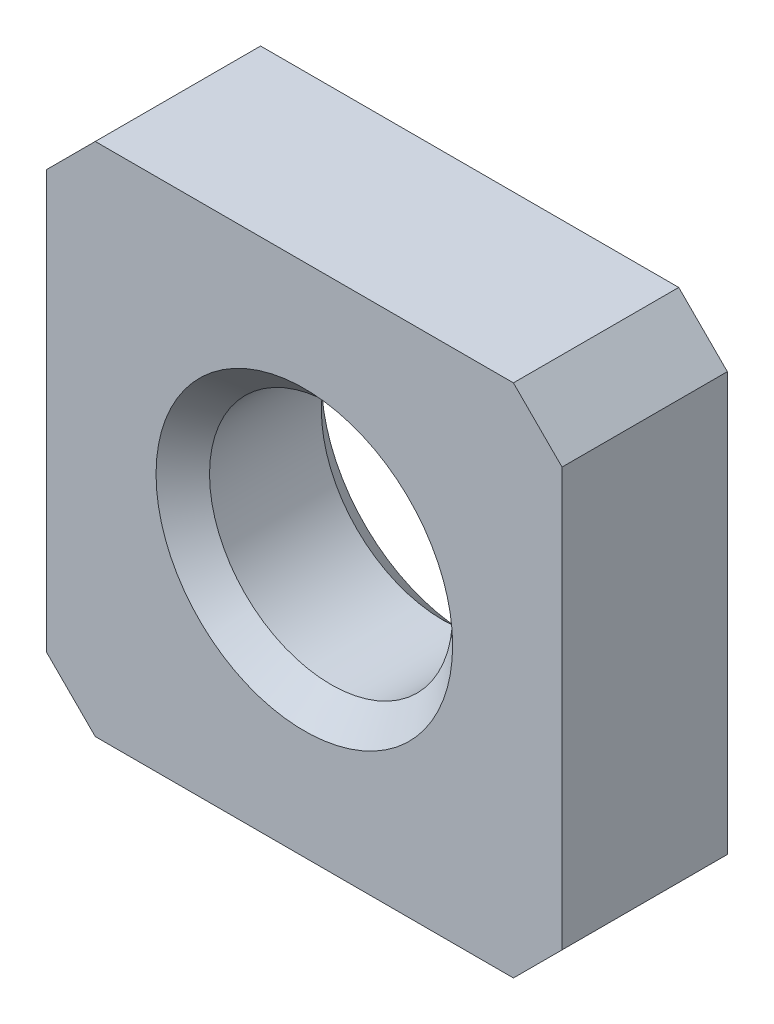
ISO-10303-21;
HEADER;
FILE_DESCRIPTION(('STEP AP214'),'2;1');
FILE_NAME('part.step','',(''),(''),'','','');
FILE_SCHEMA(('AUTOMOTIVE_DESIGN { 1 0 10303 214 1 1 1 1 }'));
ENDSEC;
DATA;
#1=APPLICATION_CONTEXT('core data for automotive mechanical design processes');
#2=APPLICATION_PROTOCOL_DEFINITION('international standard','automotive_design',2000,#1);
#3=PRODUCT_CONTEXT('',#1,'mechanical');
#4=PRODUCT('Part','Part','',(#3));
#5=PRODUCT_RELATED_PRODUCT_CATEGORY('part','',(#4));
#6=PRODUCT_DEFINITION_FORMATION('','',#4);
#7=PRODUCT_DEFINITION_CONTEXT('part definition',#1,'design');
#8=PRODUCT_DEFINITION('design','',#6,#7);
#9=PRODUCT_DEFINITION_SHAPE('','',#8);
#10=(LENGTH_UNIT() NAMED_UNIT(*) SI_UNIT(.MILLI.,.METRE.));
#11=(NAMED_UNIT(*) PLANE_ANGLE_UNIT() SI_UNIT($,.RADIAN.));
#12=(NAMED_UNIT(*) SI_UNIT($,.STERADIAN.) SOLID_ANGLE_UNIT());
#13=UNCERTAINTY_MEASURE_WITH_UNIT(LENGTH_MEASURE(1.E-05),#10,'distance_accuracy_value','');
#14=(GEOMETRIC_REPRESENTATION_CONTEXT(3) GLOBAL_UNCERTAINTY_ASSIGNED_CONTEXT((#13)) GLOBAL_UNIT_ASSIGNED_CONTEXT((#10,
#11,#12)) REPRESENTATION_CONTEXT('',''));
#15=CARTESIAN_POINT('',(0.,0.,0.));
#16=DIRECTION('',(0.,0.,1.));
#17=DIRECTION('',(1.,0.,0.));
#18=AXIS2_PLACEMENT_3D('',#15,#16,#17);
#19=CARTESIAN_POINT('',(2.65,-2.64999999999999,1.7));
#20=DIRECTION('',(-1.,0.,0.));
#21=DIRECTION('',(0.,0.,1.));
#22=AXIS2_PLACEMENT_3D('',#19,#20,#21);
#23=PLANE('',#22);
#24=DIRECTION('',(0.,1.,0.));
#25=VECTOR('',#24,1.);
#26=CARTESIAN_POINT('',(2.65,-2.64999999999999,1.7));
#27=LINE('',#26,#25);
#28=CARTESIAN_POINT('',(2.65,-2.14999999999999,1.7));
#29=VERTEX_POINT('',#28);
#30=CARTESIAN_POINT('',(2.65,2.14999999999999,1.7));
#31=VERTEX_POINT('',#30);
#32=EDGE_CURVE('E129',#29,#31,#27,.T.);
#33=ORIENTED_EDGE('',*,*,#32,.F.);
#34=DIRECTION('',(0.,0.,-1.));
#35=VECTOR('',#34,1.);
#36=CARTESIAN_POINT('',(2.65,-2.14999999999999,1.7));
#37=LINE('',#36,#35);
#38=CARTESIAN_POINT('',(2.65,-2.14999999999999,0.));
#39=VERTEX_POINT('',#38);
#40=EDGE_CURVE('E11',#29,#39,#37,.T.);
#41=ORIENTED_EDGE('',*,*,#40,.T.);
#42=DIRECTION('',(0.,1.,0.));
#43=VECTOR('',#42,1.);
#44=CARTESIAN_POINT('',(2.65,-2.64999999999999,0.));
#45=LINE('',#44,#43);
#46=CARTESIAN_POINT('',(2.65,2.14999999999999,0.));
#47=VERTEX_POINT('',#46);
#48=EDGE_CURVE('E160',#39,#47,#45,.T.);
#49=ORIENTED_EDGE('',*,*,#48,.T.);
#50=DIRECTION('',(0.,0.,1.));
#51=VECTOR('',#50,1.);
#52=CARTESIAN_POINT('',(2.65,2.14999999999999,1.7));
#53=LINE('',#52,#51);
#54=EDGE_CURVE('E43',#47,#31,#53,.T.);
#55=ORIENTED_EDGE('',*,*,#54,.T.);
#56=EDGE_LOOP('',(#33,#41,#49,#55));
#57=FACE_BOUND('',#56,.T.);
#58=ADVANCED_FACE('F35',(#57),#23,.F.);
#59=CARTESIAN_POINT('',(-2.65,2.64999999999999,1.7));
#60=DIRECTION('',(0.,-1.,0.));
#61=DIRECTION('',(0.,0.,-1.));
#62=AXIS2_PLACEMENT_3D('',#59,#60,#61);
#63=PLANE('',#62);
#64=DIRECTION('',(-1.,0.,0.));
#65=VECTOR('',#64,1.);
#66=CARTESIAN_POINT('',(-2.65,2.64999999999999,0.));
#67=LINE('',#66,#65);
#68=CARTESIAN_POINT('',(2.15,2.64999999999999,0.));
#69=VERTEX_POINT('',#68);
#70=CARTESIAN_POINT('',(-2.15,2.64999999999999,0.));
#71=VERTEX_POINT('',#70);
#72=EDGE_CURVE('E134',#69,#71,#67,.T.);
#73=ORIENTED_EDGE('',*,*,#72,.T.);
#74=DIRECTION('',(0.,0.,1.));
#75=VECTOR('',#74,1.);
#76=CARTESIAN_POINT('',(-2.15,2.64999999999999,1.7));
#77=LINE('',#76,#75);
#78=CARTESIAN_POINT('',(-2.15,2.64999999999999,1.7));
#79=VERTEX_POINT('',#78);
#80=EDGE_CURVE('E50',#71,#79,#77,.T.);
#81=ORIENTED_EDGE('',*,*,#80,.T.);
#82=DIRECTION('',(-1.,0.,0.));
#83=VECTOR('',#82,1.);
#84=CARTESIAN_POINT('',(-2.65,2.64999999999999,1.7));
#85=LINE('',#84,#83);
#86=CARTESIAN_POINT('',(2.15,2.64999999999999,1.7));
#87=VERTEX_POINT('',#86);
#88=EDGE_CURVE('E132',#87,#79,#85,.T.);
#89=ORIENTED_EDGE('',*,*,#88,.F.);
#90=DIRECTION('',(0.,0.,-1.));
#91=VECTOR('',#90,1.);
#92=CARTESIAN_POINT('',(2.15,2.64999999999999,1.7));
#93=LINE('',#92,#91);
#94=EDGE_CURVE('E152',#87,#69,#93,.T.);
#95=ORIENTED_EDGE('',*,*,#94,.T.);
#96=EDGE_LOOP('',(#73,#81,#89,#95));
#97=FACE_BOUND('',#96,.T.);
#98=ADVANCED_FACE('F167',(#97),#63,.F.);
#99=CARTESIAN_POINT('',(-2.65,-2.64999999999999,1.7));
#100=DIRECTION('',(1.,0.,0.));
#101=DIRECTION('',(0.,1.,0.));
#102=AXIS2_PLACEMENT_3D('',#99,#100,#101);
#103=PLANE('',#102);
#104=DIRECTION('',(0.,-1.,0.));
#105=VECTOR('',#104,1.);
#106=CARTESIAN_POINT('',(-2.65,-2.64999999999999,0.));
#107=LINE('',#106,#105);
#108=CARTESIAN_POINT('',(-2.65,2.14999999999999,0.));
#109=VERTEX_POINT('',#108);
#110=CARTESIAN_POINT('',(-2.65,-2.14999999999999,0.));
#111=VERTEX_POINT('',#110);
#112=EDGE_CURVE('E130',#109,#111,#107,.T.);
#113=ORIENTED_EDGE('',*,*,#112,.T.);
#114=DIRECTION('',(0.,0.,1.));
#115=VECTOR('',#114,1.);
#116=CARTESIAN_POINT('',(-2.65,-2.14999999999999,1.7));
#117=LINE('',#116,#115);
#118=CARTESIAN_POINT('',(-2.65,-2.14999999999999,1.7));
#119=VERTEX_POINT('',#118);
#120=EDGE_CURVE('E107',#111,#119,#117,.T.);
#121=ORIENTED_EDGE('',*,*,#120,.T.);
#122=DIRECTION('',(0.,-1.,0.));
#123=VECTOR('',#122,1.);
#124=CARTESIAN_POINT('',(-2.65,-2.64999999999999,1.7));
#125=LINE('',#124,#123);
#126=CARTESIAN_POINT('',(-2.65,2.14999999999999,1.7));
#127=VERTEX_POINT('',#126);
#128=EDGE_CURVE('E172',#127,#119,#125,.T.);
#129=ORIENTED_EDGE('',*,*,#128,.F.);
#130=DIRECTION('',(0.,0.,-1.));
#131=VECTOR('',#130,1.);
#132=CARTESIAN_POINT('',(-2.65,2.14999999999999,1.7));
#133=LINE('',#132,#131);
#134=EDGE_CURVE('E112',#127,#109,#133,.T.);
#135=ORIENTED_EDGE('',*,*,#134,.T.);
#136=EDGE_LOOP('',(#113,#121,#129,#135));
#137=FACE_BOUND('',#136,.T.);
#138=ADVANCED_FACE('F213',(#137),#103,.F.);
#139=CARTESIAN_POINT('',(-2.65,-2.64999999999999,1.7));
#140=DIRECTION('',(0.,1.,0.));
#141=DIRECTION('',(0.,0.,1.));
#142=AXIS2_PLACEMENT_3D('',#139,#140,#141);
#143=PLANE('',#142);
#144=DIRECTION('',(1.,0.,0.));
#145=VECTOR('',#144,1.);
#146=CARTESIAN_POINT('',(-2.65,-2.64999999999999,1.7));
#147=LINE('',#146,#145);
#148=CARTESIAN_POINT('',(-2.15,-2.64999999999999,1.7));
#149=VERTEX_POINT('',#148);
#150=CARTESIAN_POINT('',(2.15,-2.64999999999999,1.7));
#151=VERTEX_POINT('',#150);
#152=EDGE_CURVE('E122',#149,#151,#147,.T.);
#153=ORIENTED_EDGE('',*,*,#152,.F.);
#154=DIRECTION('',(0.,0.,-1.));
#155=VECTOR('',#154,1.);
#156=CARTESIAN_POINT('',(-2.15,-2.64999999999999,1.7));
#157=LINE('',#156,#155);
#158=CARTESIAN_POINT('',(-2.15,-2.64999999999999,0.));
#159=VERTEX_POINT('',#158);
#160=EDGE_CURVE('E106',#149,#159,#157,.T.);
#161=ORIENTED_EDGE('',*,*,#160,.T.);
#162=DIRECTION('',(1.,0.,0.));
#163=VECTOR('',#162,1.);
#164=CARTESIAN_POINT('',(-2.65,-2.64999999999999,0.));
#165=LINE('',#164,#163);
#166=CARTESIAN_POINT('',(2.15,-2.64999999999999,0.));
#167=VERTEX_POINT('',#166);
#168=EDGE_CURVE('E119',#159,#167,#165,.T.);
#169=ORIENTED_EDGE('',*,*,#168,.T.);
#170=DIRECTION('',(0.,0.,1.));
#171=VECTOR('',#170,1.);
#172=CARTESIAN_POINT('',(2.15,-2.64999999999999,1.7));
#173=LINE('',#172,#171);
#174=EDGE_CURVE('E124',#167,#151,#173,.T.);
#175=ORIENTED_EDGE('',*,*,#174,.T.);
#176=EDGE_LOOP('',(#153,#161,#169,#175));
#177=FACE_BOUND('',#176,.T.);
#178=ADVANCED_FACE('F118',(#177),#143,.F.);
#179=CARTESIAN_POINT('',(0.,0.,1.7));
#180=DIRECTION('',(0.,0.,-1.));
#181=DIRECTION('',(-1.,0.,0.));
#182=AXIS2_PLACEMENT_3D('',#179,#180,#181);
#183=PLANE('',#182);
#184=CARTESIAN_POINT('',(0.,0.,1.7));
#185=DIRECTION('',(0.,0.,1.));
#186=DIRECTION('',(1.,0.,0.));
#187=AXIS2_PLACEMENT_3D('',#184,#185,#186);
#188=CIRCLE('',#187,1.525);
#189=CARTESIAN_POINT('',(1.525,0.,1.7));
#190=VERTEX_POINT('',#189);
#191=EDGE_CURVE('E180',#190,#190,#188,.T.);
#192=ORIENTED_EDGE('',*,*,#191,.F.);
#193=EDGE_LOOP('',(#192));
#194=FACE_BOUND('',#193,.T.);
#195=ORIENTED_EDGE('',*,*,#128,.T.);
#196=DIRECTION('',(-0.707106781186547,0.707106781186548,0.));
#197=VECTOR('',#196,1.);
#198=CARTESIAN_POINT('',(-2.15,-2.64999999999999,1.7));
#199=LINE('',#198,#197);
#200=EDGE_CURVE('E150',#119,#149,#199,.F.);
#201=ORIENTED_EDGE('',*,*,#200,.T.);
#202=ORIENTED_EDGE('',*,*,#152,.T.);
#203=DIRECTION('',(-0.707106781186549,-0.707106781186546,0.));
#204=VECTOR('',#203,1.);
#205=CARTESIAN_POINT('',(2.65,-2.14999999999999,1.7));
#206=LINE('',#205,#204);
#207=EDGE_CURVE('E146',#151,#29,#206,.F.);
#208=ORIENTED_EDGE('',*,*,#207,.T.);
#209=ORIENTED_EDGE('',*,*,#32,.T.);
#210=DIRECTION('',(0.707106781186547,-0.707106781186548,0.));
#211=VECTOR('',#210,1.);
#212=CARTESIAN_POINT('',(2.15,2.64999999999999,1.7));
#213=LINE('',#212,#211);
#214=EDGE_CURVE('E57',#31,#87,#213,.F.);
#215=ORIENTED_EDGE('',*,*,#214,.T.);
#216=ORIENTED_EDGE('',*,*,#88,.T.);
#217=DIRECTION('',(0.707106781186549,0.707106781186546,0.));
#218=VECTOR('',#217,1.);
#219=CARTESIAN_POINT('',(-2.65,2.14999999999999,1.7));
#220=LINE('',#219,#218);
#221=EDGE_CURVE('E148',#79,#127,#220,.F.);
#222=ORIENTED_EDGE('',*,*,#221,.T.);
#223=EDGE_LOOP('',(#195,#201,#202,#208,#209,#215,#216,#222));
#224=FACE_BOUND('',#223,.T.);
#225=ADVANCED_FACE('F163',(#194,#224),#183,.F.);
#226=CARTESIAN_POINT('',(0.,0.,0.));
#227=DIRECTION('',(0.,0.,-1.));
#228=DIRECTION('',(-1.,0.,0.));
#229=AXIS2_PLACEMENT_3D('',#226,#227,#228);
#230=PLANE('',#229);
#231=CARTESIAN_POINT('',(0.,0.,0.));
#232=DIRECTION('',(0.,0.,1.));
#233=DIRECTION('',(1.,0.,0.));
#234=AXIS2_PLACEMENT_3D('',#231,#232,#233);
#235=CIRCLE('',#234,1.525);
#236=CARTESIAN_POINT('',(1.525,0.,0.));
#237=VERTEX_POINT('',#236);
#238=EDGE_CURVE('E183',#237,#237,#235,.T.);
#239=ORIENTED_EDGE('',*,*,#238,.T.);
#240=EDGE_LOOP('',(#239));
#241=FACE_BOUND('',#240,.T.);
#242=ORIENTED_EDGE('',*,*,#168,.F.);
#243=DIRECTION('',(0.707106781186547,-0.707106781186548,0.));
#244=VECTOR('',#243,1.);
#245=CARTESIAN_POINT('',(-2.4,-2.39999999999999,0.));
#246=LINE('',#245,#244);
#247=EDGE_CURVE('E102',#159,#111,#246,.F.);
#248=ORIENTED_EDGE('',*,*,#247,.T.);
#249=ORIENTED_EDGE('',*,*,#112,.F.);
#250=DIRECTION('',(-0.707106781186549,-0.707106781186546,0.));
#251=VECTOR('',#250,1.);
#252=CARTESIAN_POINT('',(-2.39999999999999,2.4,0.));
#253=LINE('',#252,#251);
#254=EDGE_CURVE('E113',#109,#71,#253,.F.);
#255=ORIENTED_EDGE('',*,*,#254,.T.);
#256=ORIENTED_EDGE('',*,*,#72,.F.);
#257=DIRECTION('',(-0.707106781186547,0.707106781186548,0.));
#258=VECTOR('',#257,1.);
#259=CARTESIAN_POINT('',(2.4,2.39999999999999,0.));
#260=LINE('',#259,#258);
#261=EDGE_CURVE('E123',#69,#47,#260,.F.);
#262=ORIENTED_EDGE('',*,*,#261,.T.);
#263=ORIENTED_EDGE('',*,*,#48,.F.);
#264=DIRECTION('',(0.707106781186549,0.707106781186546,0.));
#265=VECTOR('',#264,1.);
#266=CARTESIAN_POINT('',(2.39999999999999,-2.4,0.));
#267=LINE('',#266,#265);
#268=EDGE_CURVE('E128',#39,#167,#267,.F.);
#269=ORIENTED_EDGE('',*,*,#268,.T.);
#270=EDGE_LOOP('',(#242,#248,#249,#255,#256,#262,#263,#269));
#271=FACE_BOUND('',#270,.T.);
#272=ADVANCED_FACE('F126',(#241,#271),#230,.T.);
#273=CARTESIAN_POINT('',(0.,0.,0.275));
#274=DIRECTION('',(0.,0.,-1.));
#275=DIRECTION('',(-1.,0.,0.));
#276=AXIS2_PLACEMENT_3D('',#273,#274,#275);
#277=CONICAL_SURFACE('',#276,1.25,0.785398163397448);
#278=ORIENTED_EDGE('',*,*,#238,.F.);
#279=EDGE_LOOP('',(#278));
#280=FACE_BOUND('',#279,.T.);
#281=CARTESIAN_POINT('',(0.,0.,0.275));
#282=DIRECTION('',(0.,0.,1.));
#283=DIRECTION('',(1.,0.,0.));
#284=AXIS2_PLACEMENT_3D('',#281,#282,#283);
#285=CIRCLE('',#284,1.25);
#286=CARTESIAN_POINT('',(1.25,0.,0.275));
#287=VERTEX_POINT('',#286);
#288=EDGE_CURVE('E168',#287,#287,#285,.T.);
#289=ORIENTED_EDGE('',*,*,#288,.T.);
#290=EDGE_LOOP('',(#289));
#291=FACE_BOUND('',#290,.T.);
#292=ADVANCED_FACE('F188',(#280,#291),#277,.F.);
#293=CARTESIAN_POINT('',(0.,0.,1.7));
#294=DIRECTION('',(0.,0.,1.));
#295=DIRECTION('',(1.,0.,0.));
#296=AXIS2_PLACEMENT_3D('',#293,#294,#295);
#297=CYLINDRICAL_SURFACE('',#296,1.25);
#298=ORIENTED_EDGE('',*,*,#288,.F.);
#299=EDGE_LOOP('',(#298));
#300=FACE_BOUND('',#299,.T.);
#301=CARTESIAN_POINT('',(0.,0.,1.425));
#302=DIRECTION('',(0.,0.,1.));
#303=DIRECTION('',(1.,0.,0.));
#304=AXIS2_PLACEMENT_3D('',#301,#302,#303);
#305=CIRCLE('',#304,1.25);
#306=CARTESIAN_POINT('',(1.25,0.,1.425));
#307=VERTEX_POINT('',#306);
#308=EDGE_CURVE('E177',#307,#307,#305,.T.);
#309=ORIENTED_EDGE('',*,*,#308,.T.);
#310=EDGE_LOOP('',(#309));
#311=FACE_BOUND('',#310,.T.);
#312=ADVANCED_FACE('F191',(#300,#311),#297,.F.);
#313=CARTESIAN_POINT('',(0.,0.,1.7));
#314=DIRECTION('',(0.,0.,1.));
#315=DIRECTION('',(1.,0.,0.));
#316=AXIS2_PLACEMENT_3D('',#313,#314,#315);
#317=CONICAL_SURFACE('',#316,1.525,0.785398163397447);
#318=ORIENTED_EDGE('',*,*,#308,.F.);
#319=EDGE_LOOP('',(#318));
#320=FACE_BOUND('',#319,.T.);
#321=ORIENTED_EDGE('',*,*,#191,.T.);
#322=EDGE_LOOP('',(#321));
#323=FACE_BOUND('',#322,.T.);
#324=ADVANCED_FACE('F197',(#320,#323),#317,.F.);
#325=CARTESIAN_POINT('',(-2.15,-2.64999999999999,1.7));
#326=DIRECTION('',(0.707106781186548,0.707106781186547,0.));
#327=DIRECTION('',(0.,0.,-1.));
#328=AXIS2_PLACEMENT_3D('',#325,#326,#327);
#329=PLANE('',#328);
#330=ORIENTED_EDGE('',*,*,#200,.F.);
#331=ORIENTED_EDGE('',*,*,#120,.F.);
#332=ORIENTED_EDGE('',*,*,#247,.F.);
#333=ORIENTED_EDGE('',*,*,#160,.F.);
#334=EDGE_LOOP('',(#330,#331,#332,#333));
#335=FACE_BOUND('',#334,.T.);
#336=ADVANCED_FACE('F105',(#335),#329,.F.);
#337=CARTESIAN_POINT('',(-2.65,2.14999999999999,1.7));
#338=DIRECTION('',(0.707106781186546,-0.707106781186549,0.));
#339=DIRECTION('',(0.,0.,-1.));
#340=AXIS2_PLACEMENT_3D('',#337,#338,#339);
#341=PLANE('',#340);
#342=ORIENTED_EDGE('',*,*,#221,.F.);
#343=ORIENTED_EDGE('',*,*,#80,.F.);
#344=ORIENTED_EDGE('',*,*,#254,.F.);
#345=ORIENTED_EDGE('',*,*,#134,.F.);
#346=EDGE_LOOP('',(#342,#343,#344,#345));
#347=FACE_BOUND('',#346,.T.);
#348=ADVANCED_FACE('F225',(#347),#341,.F.);
#349=CARTESIAN_POINT('',(2.65,-2.14999999999999,1.7));
#350=DIRECTION('',(-0.707106781186546,0.707106781186549,0.));
#351=DIRECTION('',(0.,0.,-1.));
#352=AXIS2_PLACEMENT_3D('',#349,#350,#351);
#353=PLANE('',#352);
#354=ORIENTED_EDGE('',*,*,#207,.F.);
#355=ORIENTED_EDGE('',*,*,#174,.F.);
#356=ORIENTED_EDGE('',*,*,#268,.F.);
#357=ORIENTED_EDGE('',*,*,#40,.F.);
#358=EDGE_LOOP('',(#354,#355,#356,#357));
#359=FACE_BOUND('',#358,.T.);
#360=ADVANCED_FACE('F227',(#359),#353,.F.);
#361=CARTESIAN_POINT('',(2.15,2.64999999999999,1.7));
#362=DIRECTION('',(-0.707106781186548,-0.707106781186547,0.));
#363=DIRECTION('',(0.,0.,-1.));
#364=AXIS2_PLACEMENT_3D('',#361,#362,#363);
#365=PLANE('',#364);
#366=ORIENTED_EDGE('',*,*,#214,.F.);
#367=ORIENTED_EDGE('',*,*,#54,.F.);
#368=ORIENTED_EDGE('',*,*,#261,.F.);
#369=ORIENTED_EDGE('',*,*,#94,.F.);
#370=EDGE_LOOP('',(#366,#367,#368,#369));
#371=FACE_BOUND('',#370,.T.);
#372=ADVANCED_FACE('F37',(#371),#365,.F.);
#373=CLOSED_SHELL('',(#58,#98,#138,#178,#225,#272,#292,#312,#324,#336,#348,#360,#372));
#374=MANIFOLD_SOLID_BREP('B2',#373);
#375=ADVANCED_BREP_SHAPE_REPRESENTATION('',(#18,#374),#14);
#376=SHAPE_DEFINITION_REPRESENTATION(#9,#375);
ENDSEC;
END-ISO-10303-21;
